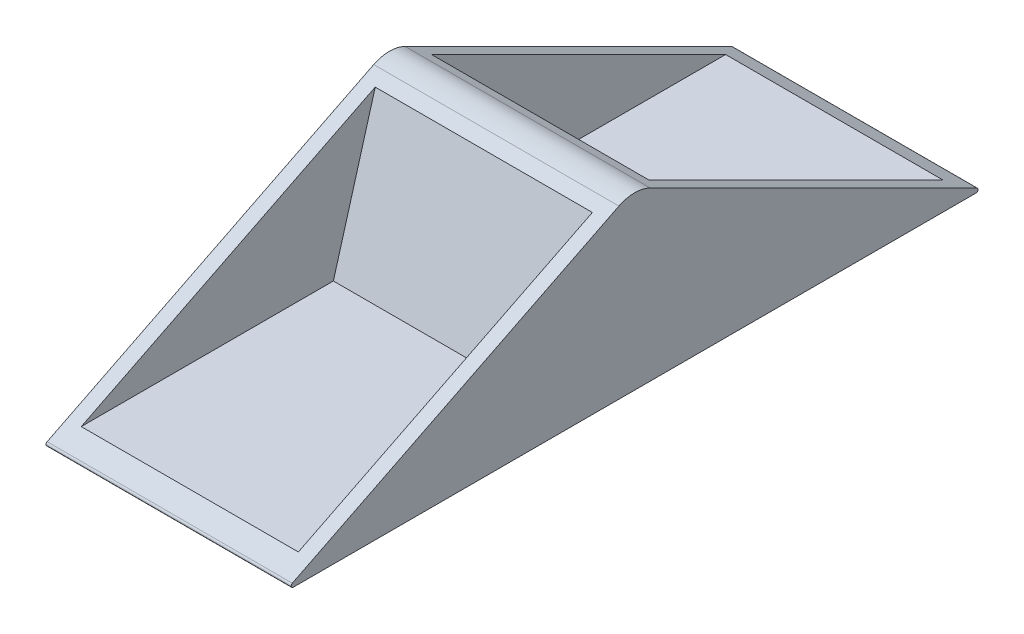
ISO-10303-21;
HEADER;
FILE_DESCRIPTION(('STEP AP214'),'2;1');
FILE_NAME('part.step','',(''),(''),'','','');
FILE_SCHEMA(('AUTOMOTIVE_DESIGN { 1 0 10303 214 1 1 1 1 }'));
ENDSEC;
DATA;
#1=APPLICATION_CONTEXT('core data for automotive mechanical design processes');
#2=APPLICATION_PROTOCOL_DEFINITION('international standard','automotive_design',2000,#1);
#3=PRODUCT_CONTEXT('',#1,'mechanical');
#4=PRODUCT('Part','Part','',(#3));
#5=PRODUCT_RELATED_PRODUCT_CATEGORY('part','',(#4));
#6=PRODUCT_DEFINITION_FORMATION('','',#4);
#7=PRODUCT_DEFINITION_CONTEXT('part definition',#1,'design');
#8=PRODUCT_DEFINITION('design','',#6,#7);
#9=PRODUCT_DEFINITION_SHAPE('','',#8);
#10=(LENGTH_UNIT() NAMED_UNIT(*) SI_UNIT(.MILLI.,.METRE.));
#11=(NAMED_UNIT(*) PLANE_ANGLE_UNIT() SI_UNIT($,.RADIAN.));
#12=(NAMED_UNIT(*) SI_UNIT($,.STERADIAN.) SOLID_ANGLE_UNIT());
#13=UNCERTAINTY_MEASURE_WITH_UNIT(LENGTH_MEASURE(1.E-05),#10,'distance_accuracy_value','');
#14=(GEOMETRIC_REPRESENTATION_CONTEXT(3) GLOBAL_UNCERTAINTY_ASSIGNED_CONTEXT((#13)) GLOBAL_UNIT_ASSIGNED_CONTEXT((#10,
#11,#12)) REPRESENTATION_CONTEXT('',''));
#15=CARTESIAN_POINT('',(0.,0.,0.));
#16=DIRECTION('',(0.,0.,1.));
#17=DIRECTION('',(1.,0.,0.));
#18=AXIS2_PLACEMENT_3D('',#15,#16,#17);
#19=CARTESIAN_POINT('',(35.,0.,0.));
#20=DIRECTION('',(0.,1.,0.));
#21=DIRECTION('',(0.,0.,1.));
#22=AXIS2_PLACEMENT_3D('',#19,#20,#21);
#23=PLANE('',#22);
#24=DIRECTION('',(0.,0.,-1.));
#25=VECTOR('',#24,1.);
#26=CARTESIAN_POINT('',(35.,0.,0.));
#27=LINE('',#26,#25);
#28=CARTESIAN_POINT('',(35.,0.,48.7291796067501));
#29=VERTEX_POINT('',#28);
#30=CARTESIAN_POINT('',(35.,0.,-48.7291796067501));
#31=VERTEX_POINT('',#30);
#32=EDGE_CURVE('E285',#29,#31,#27,.T.);
#33=ORIENTED_EDGE('',*,*,#32,.F.);
#34=DIRECTION('',(-1.,0.,0.));
#35=VECTOR('',#34,1.);
#36=CARTESIAN_POINT('',(0.,0.,48.7291796067501));
#37=LINE('',#36,#35);
#38=CARTESIAN_POINT('',(0.,0.,48.7291796067501));
#39=VERTEX_POINT('',#38);
#40=EDGE_CURVE('E325',#29,#39,#37,.T.);
#41=ORIENTED_EDGE('',*,*,#40,.T.);
#42=DIRECTION('',(0.,0.,-1.));
#43=VECTOR('',#42,1.);
#44=CARTESIAN_POINT('',(0.,0.,0.));
#45=LINE('',#44,#43);
#46=CARTESIAN_POINT('',(0.,0.,-48.7291796067501));
#47=VERTEX_POINT('',#46);
#48=EDGE_CURVE('E283',#39,#47,#45,.T.);
#49=ORIENTED_EDGE('',*,*,#48,.T.);
#50=DIRECTION('',(-1.,0.,0.));
#51=VECTOR('',#50,1.);
#52=CARTESIAN_POINT('',(35.,0.,-48.7291796067501));
#53=LINE('',#52,#51);
#54=EDGE_CURVE('E321',#47,#31,#53,.F.);
#55=ORIENTED_EDGE('',*,*,#54,.T.);
#56=EDGE_LOOP('',(#33,#41,#49,#55));
#57=FACE_BOUND('',#56,.T.);
#58=DIRECTION('',(0.,0.,1.));
#59=VECTOR('',#58,1.);
#60=CARTESIAN_POINT('',(6.5,0.,0.));
#61=LINE('',#60,#59);
#62=CARTESIAN_POINT('',(6.50000000000001,0.,-11.));
#63=VERTEX_POINT('',#62);
#64=CARTESIAN_POINT('',(6.5,0.,11.));
#65=VERTEX_POINT('',#64);
#66=EDGE_CURVE('E56',#63,#65,#61,.T.);
#67=ORIENTED_EDGE('',*,*,#66,.T.);
#68=DIRECTION('',(-1.,0.,0.));
#69=VECTOR('',#68,1.);
#70=CARTESIAN_POINT('',(0.,0.,11.));
#71=LINE('',#70,#69);
#72=CARTESIAN_POINT('',(28.5,0.,11.));
#73=VERTEX_POINT('',#72);
#74=EDGE_CURVE('E173',#73,#65,#71,.T.);
#75=ORIENTED_EDGE('',*,*,#74,.F.);
#76=DIRECTION('',(0.,0.,1.));
#77=VECTOR('',#76,1.);
#78=CARTESIAN_POINT('',(28.5,0.,0.));
#79=LINE('',#78,#77);
#80=CARTESIAN_POINT('',(28.5,0.,-11.));
#81=VERTEX_POINT('',#80);
#82=EDGE_CURVE('E176',#81,#73,#79,.T.);
#83=ORIENTED_EDGE('',*,*,#82,.F.);
#84=DIRECTION('',(-1.,0.,0.));
#85=VECTOR('',#84,1.);
#86=CARTESIAN_POINT('',(0.,0.,-11.));
#87=LINE('',#86,#85);
#88=EDGE_CURVE('E182',#81,#63,#87,.T.);
#89=ORIENTED_EDGE('',*,*,#88,.T.);
#90=EDGE_LOOP('',(#67,#75,#83,#89));
#91=FACE_BOUND('',#90,.T.);
#92=ADVANCED_FACE('F41',(#57,#91),#23,.F.);
#93=CARTESIAN_POINT('',(35.,2.,0.));
#94=DIRECTION('',(0.,1.,0.));
#95=DIRECTION('',(0.,0.,1.));
#96=AXIS2_PLACEMENT_3D('',#93,#94,#95);
#97=PLANE('',#96);
#98=DIRECTION('',(0.,0.,-1.));
#99=VECTOR('',#98,1.);
#100=CARTESIAN_POINT('',(2.,2.,0.));
#101=LINE('',#100,#99);
#102=CARTESIAN_POINT('',(1.99999999999999,2.,-10.));
#103=VERTEX_POINT('',#102);
#104=CARTESIAN_POINT('',(2.,2.,-46.));
#105=VERTEX_POINT('',#104);
#106=EDGE_CURVE('E235',#103,#105,#101,.T.);
#107=ORIENTED_EDGE('',*,*,#106,.F.);
#108=DIRECTION('',(-1.,0.,0.));
#109=VECTOR('',#108,1.);
#110=CARTESIAN_POINT('',(33.,2.,-10.));
#111=LINE('',#110,#109);
#112=CARTESIAN_POINT('',(33.,2.,-10.));
#113=VERTEX_POINT('',#112);
#114=EDGE_CURVE('E210',#113,#103,#111,.T.);
#115=ORIENTED_EDGE('',*,*,#114,.F.);
#116=DIRECTION('',(0.,0.,-1.));
#117=VECTOR('',#116,1.);
#118=CARTESIAN_POINT('',(33.,2.,0.));
#119=LINE('',#118,#117);
#120=CARTESIAN_POINT('',(33.,2.,-46.));
#121=VERTEX_POINT('',#120);
#122=EDGE_CURVE('E249',#113,#121,#119,.T.);
#123=ORIENTED_EDGE('',*,*,#122,.T.);
#124=DIRECTION('',(-1.,0.,0.));
#125=VECTOR('',#124,1.);
#126=CARTESIAN_POINT('',(35.,2.,-46.));
#127=LINE('',#126,#125);
#128=EDGE_CURVE('E253',#121,#105,#127,.T.);
#129=ORIENTED_EDGE('',*,*,#128,.T.);
#130=EDGE_LOOP('',(#107,#115,#123,#129));
#131=FACE_BOUND('',#130,.T.);
#132=ADVANCED_FACE('F342',(#131),#97,.T.);
#133=CARTESIAN_POINT('',(33.,0.,0.));
#134=DIRECTION('',(-1.,0.,0.));
#135=DIRECTION('',(0.,0.,1.));
#136=AXIS2_PLACEMENT_3D('',#133,#134,#135);
#137=PLANE('',#136);
#138=ORIENTED_EDGE('',*,*,#122,.F.);
#139=DIRECTION('',(0.,0.96178211048663,0.273815945386464));
#140=VECTOR('',#139,1.);
#141=CARTESIAN_POINT('',(33.,2.,-10.));
#142=LINE('',#141,#140);
#143=CARTESIAN_POINT('',(33.,22.9875388202502,-4.02492235949965));
#144=VERTEX_POINT('',#143);
#145=EDGE_CURVE('E206',#113,#144,#142,.T.);
#146=ORIENTED_EDGE('',*,*,#145,.T.);
#147=DIRECTION('',(0.,0.447213595499958,0.894427190999916));
#148=VECTOR('',#147,1.);
#149=CARTESIAN_POINT('',(33.,20.,-10.));
#150=LINE('',#149,#148);
#151=EDGE_CURVE('E268',#121,#144,#150,.T.);
#152=ORIENTED_EDGE('',*,*,#151,.F.);
#153=EDGE_LOOP('',(#138,#146,#152));
#154=FACE_BOUND('',#153,.T.);
#155=ADVANCED_FACE('F344',(#154),#137,.T.);
#156=CARTESIAN_POINT('',(2.,0.,0.));
#157=DIRECTION('',(-1.,0.,0.));
#158=DIRECTION('',(0.,0.,1.));
#159=AXIS2_PLACEMENT_3D('',#156,#157,#158);
#160=PLANE('',#159);
#161=DIRECTION('',(0.,0.96178211048663,0.273815945386464));
#162=VECTOR('',#161,1.);
#163=CARTESIAN_POINT('',(1.99999999999999,2.,-10.));
#164=LINE('',#163,#162);
#165=CARTESIAN_POINT('',(1.99999999999999,22.9875388202502,-4.02492235949965));
#166=VERTEX_POINT('',#165);
#167=EDGE_CURVE('E195',#103,#166,#164,.T.);
#168=ORIENTED_EDGE('',*,*,#167,.F.);
#169=ORIENTED_EDGE('',*,*,#106,.T.);
#170=DIRECTION('',(0.,0.447213595499958,0.894427190999916));
#171=VECTOR('',#170,1.);
#172=CARTESIAN_POINT('',(2.,20.,-10.));
#173=LINE('',#172,#171);
#174=EDGE_CURVE('E243',#105,#166,#173,.T.);
#175=ORIENTED_EDGE('',*,*,#174,.T.);
#176=EDGE_LOOP('',(#168,#169,#175));
#177=FACE_BOUND('',#176,.T.);
#178=ADVANCED_FACE('F347',(#177),#160,.F.);
#179=DIRECTION('',(-1.,0.,0.));
#180=VECTOR('',#179,1.);
#181=CARTESIAN_POINT('',(33.,2.,10.));
#182=LINE('',#181,#180);
#183=CARTESIAN_POINT('',(33.,2.,10.));
#184=VERTEX_POINT('',#183);
#185=CARTESIAN_POINT('',(2.,2.,10.));
#186=VERTEX_POINT('',#185);
#187=EDGE_CURVE('E196',#184,#186,#182,.T.);
#188=ORIENTED_EDGE('',*,*,#187,.T.);
#189=CARTESIAN_POINT('',(2.,2.,46.));
#190=VERTEX_POINT('',#189);
#191=EDGE_CURVE('E239',#190,#186,#101,.T.);
#192=ORIENTED_EDGE('',*,*,#191,.F.);
#193=DIRECTION('',(-1.,0.,0.));
#194=VECTOR('',#193,1.);
#195=CARTESIAN_POINT('',(35.,2.,46.));
#196=LINE('',#195,#194);
#197=CARTESIAN_POINT('',(33.,2.,46.));
#198=VERTEX_POINT('',#197);
#199=EDGE_CURVE('E256',#198,#190,#196,.T.);
#200=ORIENTED_EDGE('',*,*,#199,.F.);
#201=EDGE_CURVE('E266',#198,#184,#119,.T.);
#202=ORIENTED_EDGE('',*,*,#201,.T.);
#203=EDGE_LOOP('',(#188,#192,#200,#202));
#204=FACE_BOUND('',#203,.T.);
#205=ADVANCED_FACE('F366',(#204),#97,.T.);
#206=DIRECTION('',(0.,0.96178211048663,-0.273815945386464));
#207=VECTOR('',#206,1.);
#208=CARTESIAN_POINT('',(33.,2.,10.));
#209=LINE('',#208,#207);
#210=CARTESIAN_POINT('',(33.,22.9875388202502,4.02492235949964));
#211=VERTEX_POINT('',#210);
#212=EDGE_CURVE('E192',#184,#211,#209,.T.);
#213=ORIENTED_EDGE('',*,*,#212,.F.);
#214=ORIENTED_EDGE('',*,*,#201,.F.);
#215=DIRECTION('',(0.,0.447213595499958,-0.894427190999916));
#216=VECTOR('',#215,1.);
#217=CARTESIAN_POINT('',(33.,20.,10.));
#218=LINE('',#217,#216);
#219=EDGE_CURVE('E259',#198,#211,#218,.T.);
#220=ORIENTED_EDGE('',*,*,#219,.T.);
#221=EDGE_LOOP('',(#213,#214,#220));
#222=FACE_BOUND('',#221,.T.);
#223=ADVANCED_FACE('F486',(#222),#137,.T.);
#224=ORIENTED_EDGE('',*,*,#191,.T.);
#225=DIRECTION('',(0.,0.96178211048663,-0.273815945386464));
#226=VECTOR('',#225,1.);
#227=CARTESIAN_POINT('',(1.99999999999999,2.,10.));
#228=LINE('',#227,#226);
#229=CARTESIAN_POINT('',(1.99999999999999,22.9875388202502,4.02492235949964));
#230=VERTEX_POINT('',#229);
#231=EDGE_CURVE('E188',#186,#230,#228,.T.);
#232=ORIENTED_EDGE('',*,*,#231,.T.);
#233=DIRECTION('',(0.,0.447213595499958,-0.894427190999916));
#234=VECTOR('',#233,1.);
#235=CARTESIAN_POINT('',(2.,20.,10.));
#236=LINE('',#235,#234);
#237=EDGE_CURVE('E222',#190,#230,#236,.T.);
#238=ORIENTED_EDGE('',*,*,#237,.F.);
#239=EDGE_LOOP('',(#224,#232,#238));
#240=FACE_BOUND('',#239,.T.);
#241=ADVANCED_FACE('F460',(#240),#160,.F.);
#242=CARTESIAN_POINT('',(35.,25.,0.));
#243=DIRECTION('',(0.,-0.894427190999916,0.447213595499958));
#244=DIRECTION('',(0.,-0.447213595499958,-0.894427190999916));
#245=AXIS2_PLACEMENT_3D('',#242,#243,#244);
#246=PLANE('',#245);
#247=DIRECTION('',(0.,0.447213595499958,0.894427190999916));
#248=VECTOR('',#247,1.);
#249=CARTESIAN_POINT('',(35.,25.,0.));
#250=LINE('',#249,#248);
#251=CARTESIAN_POINT('',(35.,0.568328157299965,-48.8633436854001));
#252=VERTEX_POINT('',#251);
#253=CARTESIAN_POINT('',(35.,23.8819660112501,-2.23606797749979));
#254=VERTEX_POINT('',#253);
#255=EDGE_CURVE('E287',#252,#254,#250,.T.);
#256=ORIENTED_EDGE('',*,*,#255,.F.);
#257=DIRECTION('',(-1.,0.,0.));
#258=VECTOR('',#257,1.);
#259=CARTESIAN_POINT('',(35.,0.568328157299972,-48.8633436854001));
#260=LINE('',#259,#258);
#261=CARTESIAN_POINT('',(0.,0.568328157299965,-48.8633436854001));
#262=VERTEX_POINT('',#261);
#263=EDGE_CURVE('E304',#252,#262,#260,.T.);
#264=ORIENTED_EDGE('',*,*,#263,.T.);
#265=DIRECTION('',(0.,0.447213595499958,0.894427190999916));
#266=VECTOR('',#265,1.);
#267=CARTESIAN_POINT('',(0.,25.,0.));
#268=LINE('',#267,#266);
#269=CARTESIAN_POINT('',(0.,23.8819660112501,-2.23606797749979));
#270=VERTEX_POINT('',#269);
#271=EDGE_CURVE('E244',#262,#270,#268,.T.);
#272=ORIENTED_EDGE('',*,*,#271,.T.);
#273=DIRECTION('',(-1.,0.,0.));
#274=VECTOR('',#273,1.);
#275=CARTESIAN_POINT('',(35.,23.8819660112501,-2.23606797749979));
#276=LINE('',#275,#274);
#277=EDGE_CURVE('E301',#270,#254,#276,.F.);
#278=ORIENTED_EDGE('',*,*,#277,.T.);
#279=EDGE_LOOP('',(#256,#264,#272,#278));
#280=FACE_BOUND('',#279,.T.);
#281=ORIENTED_EDGE('',*,*,#174,.F.);
#282=ORIENTED_EDGE('',*,*,#128,.F.);
#283=ORIENTED_EDGE('',*,*,#151,.T.);
#284=DIRECTION('',(-1.,0.,0.));
#285=VECTOR('',#284,1.);
#286=CARTESIAN_POINT('',(33.,22.9875388202502,-4.02492235949965));
#287=LINE('',#286,#285);
#288=EDGE_CURVE('E209',#144,#166,#287,.T.);
#289=ORIENTED_EDGE('',*,*,#288,.T.);
#290=EDGE_LOOP('',(#281,#282,#283,#289));
#291=FACE_BOUND('',#290,.T.);
#292=ADVANCED_FACE('F299',(#280,#291),#246,.F.);
#293=CARTESIAN_POINT('',(35.,25.,0.));
#294=DIRECTION('',(0.,0.894427190999916,0.447213595499958));
#295=DIRECTION('',(0.,-0.447213595499958,0.894427190999916));
#296=AXIS2_PLACEMENT_3D('',#293,#294,#295);
#297=PLANE('',#296);
#298=DIRECTION('',(-1.,0.,0.));
#299=VECTOR('',#298,1.);
#300=CARTESIAN_POINT('',(33.,22.9875388202502,4.02492235949964));
#301=LINE('',#300,#299);
#302=EDGE_CURVE('E219',#211,#230,#301,.T.);
#303=ORIENTED_EDGE('',*,*,#302,.F.);
#304=ORIENTED_EDGE('',*,*,#219,.F.);
#305=ORIENTED_EDGE('',*,*,#199,.T.);
#306=ORIENTED_EDGE('',*,*,#237,.T.);
#307=EDGE_LOOP('',(#303,#304,#305,#306));
#308=FACE_BOUND('',#307,.T.);
#309=DIRECTION('',(0.,0.447213595499958,-0.894427190999916));
#310=VECTOR('',#309,1.);
#311=CARTESIAN_POINT('',(0.,25.,0.));
#312=LINE('',#311,#310);
#313=CARTESIAN_POINT('',(0.,0.568328157299965,48.8633436854001));
#314=VERTEX_POINT('',#313);
#315=CARTESIAN_POINT('',(0.,23.8819660112501,2.23606797749979));
#316=VERTEX_POINT('',#315);
#317=EDGE_CURVE('E274',#314,#316,#312,.T.);
#318=ORIENTED_EDGE('',*,*,#317,.F.);
#319=DIRECTION('',(-1.,0.,0.));
#320=VECTOR('',#319,1.);
#321=CARTESIAN_POINT('',(35.,0.568328157299973,48.8633436854001));
#322=LINE('',#321,#320);
#323=CARTESIAN_POINT('',(35.,0.568328157299965,48.8633436854001));
#324=VERTEX_POINT('',#323);
#325=EDGE_CURVE('E49',#314,#324,#322,.F.);
#326=ORIENTED_EDGE('',*,*,#325,.T.);
#327=DIRECTION('',(0.,0.447213595499958,-0.894427190999916));
#328=VECTOR('',#327,1.);
#329=CARTESIAN_POINT('',(35.,25.,0.));
#330=LINE('',#329,#328);
#331=CARTESIAN_POINT('',(35.,23.8819660112501,2.23606797749979));
#332=VERTEX_POINT('',#331);
#333=EDGE_CURVE('E278',#324,#332,#330,.T.);
#334=ORIENTED_EDGE('',*,*,#333,.T.);
#335=DIRECTION('',(-1.,0.,0.));
#336=VECTOR('',#335,1.);
#337=CARTESIAN_POINT('',(0.,23.8819660112501,2.23606797749979));
#338=LINE('',#337,#336);
#339=EDGE_CURVE('E288',#332,#316,#338,.T.);
#340=ORIENTED_EDGE('',*,*,#339,.T.);
#341=EDGE_LOOP('',(#318,#326,#334,#340));
#342=FACE_BOUND('',#341,.T.);
#343=ADVANCED_FACE('F330',(#308,#342),#297,.T.);
#344=CARTESIAN_POINT('',(35.,0.,0.));
#345=DIRECTION('',(-1.,0.,0.));
#346=DIRECTION('',(0.,0.,1.));
#347=AXIS2_PLACEMENT_3D('',#344,#345,#346);
#348=PLANE('',#347);
#349=ORIENTED_EDGE('',*,*,#333,.F.);
#350=CARTESIAN_POINT('',(35.,0.3,48.7291796067501));
#351=DIRECTION('',(-1.,0.,0.));
#352=DIRECTION('',(0.,0.,1.));
#353=AXIS2_PLACEMENT_3D('',#350,#351,#352);
#354=CIRCLE('',#353,0.3);
#355=EDGE_CURVE('E12',#324,#29,#354,.F.);
#356=ORIENTED_EDGE('',*,*,#355,.T.);
#357=ORIENTED_EDGE('',*,*,#32,.T.);
#358=CARTESIAN_POINT('',(35.,0.300000000000002,-48.7291796067501));
#359=DIRECTION('',(-1.,0.,0.));
#360=DIRECTION('',(0.,0.,1.));
#361=AXIS2_PLACEMENT_3D('',#358,#359,#360);
#362=CIRCLE('',#361,0.3);
#363=EDGE_CURVE('E323',#31,#252,#362,.F.);
#364=ORIENTED_EDGE('',*,*,#363,.T.);
#365=ORIENTED_EDGE('',*,*,#255,.T.);
#366=CARTESIAN_POINT('',(35.,19.4098300562505,0.));
#367=DIRECTION('',(-1.,0.,0.));
#368=DIRECTION('',(0.,0.,1.));
#369=AXIS2_PLACEMENT_3D('',#366,#367,#368);
#370=CIRCLE('',#369,5.);
#371=EDGE_CURVE('E313',#254,#332,#370,.F.);
#372=ORIENTED_EDGE('',*,*,#371,.T.);
#373=EDGE_LOOP('',(#349,#356,#357,#364,#365,#372));
#374=FACE_BOUND('',#373,.T.);
#375=ADVANCED_FACE('F334',(#374),#348,.F.);
#376=CARTESIAN_POINT('',(0.,0.,0.));
#377=DIRECTION('',(-1.,0.,0.));
#378=DIRECTION('',(0.,0.,1.));
#379=AXIS2_PLACEMENT_3D('',#376,#377,#378);
#380=PLANE('',#379);
#381=ORIENTED_EDGE('',*,*,#48,.F.);
#382=CARTESIAN_POINT('',(0.,0.3,48.7291796067501));
#383=DIRECTION('',(-1.,0.,0.));
#384=DIRECTION('',(0.,0.,1.));
#385=AXIS2_PLACEMENT_3D('',#382,#383,#384);
#386=CIRCLE('',#385,0.3);
#387=EDGE_CURVE('E327',#39,#314,#386,.T.);
#388=ORIENTED_EDGE('',*,*,#387,.T.);
#389=ORIENTED_EDGE('',*,*,#317,.T.);
#390=CARTESIAN_POINT('',(0.,19.4098300562505,0.));
#391=DIRECTION('',(-1.,0.,0.));
#392=DIRECTION('',(0.,0.,1.));
#393=AXIS2_PLACEMENT_3D('',#390,#391,#392);
#394=CIRCLE('',#393,5.);
#395=EDGE_CURVE('E305',#316,#270,#394,.T.);
#396=ORIENTED_EDGE('',*,*,#395,.T.);
#397=ORIENTED_EDGE('',*,*,#271,.F.);
#398=CARTESIAN_POINT('',(0.,0.300000000000002,-48.7291796067501));
#399=DIRECTION('',(-1.,0.,0.));
#400=DIRECTION('',(0.,0.,1.));
#401=AXIS2_PLACEMENT_3D('',#398,#399,#400);
#402=CIRCLE('',#401,0.3);
#403=EDGE_CURVE('E319',#262,#47,#402,.T.);
#404=ORIENTED_EDGE('',*,*,#403,.T.);
#405=EDGE_LOOP('',(#381,#388,#389,#396,#397,#404));
#406=FACE_BOUND('',#405,.T.);
#407=ADVANCED_FACE('F306',(#406),#380,.T.);
#408=CARTESIAN_POINT('',(33.,2.,-10.));
#409=DIRECTION('',(0.,-0.273815945386464,0.961782110486631));
#410=DIRECTION('',(0.,-0.961782110486631,-0.273815945386464));
#411=AXIS2_PLACEMENT_3D('',#408,#409,#410);
#412=PLANE('',#411);
#413=ORIENTED_EDGE('',*,*,#167,.T.);
#414=ORIENTED_EDGE('',*,*,#288,.F.);
#415=ORIENTED_EDGE('',*,*,#145,.F.);
#416=ORIENTED_EDGE('',*,*,#114,.T.);
#417=EDGE_LOOP('',(#413,#414,#415,#416));
#418=FACE_BOUND('',#417,.T.);
#419=ADVANCED_FACE('F349',(#418),#412,.F.);
#420=CARTESIAN_POINT('',(33.,2.,10.));
#421=DIRECTION('',(0.,0.273815945386464,0.96178211048663));
#422=DIRECTION('',(0.,-0.961782110486631,0.273815945386464));
#423=AXIS2_PLACEMENT_3D('',#420,#421,#422);
#424=PLANE('',#423);
#425=ORIENTED_EDGE('',*,*,#231,.F.);
#426=ORIENTED_EDGE('',*,*,#187,.F.);
#427=ORIENTED_EDGE('',*,*,#212,.T.);
#428=ORIENTED_EDGE('',*,*,#302,.T.);
#429=EDGE_LOOP('',(#425,#426,#427,#428));
#430=FACE_BOUND('',#429,.T.);
#431=ADVANCED_FACE('F351',(#430),#424,.T.);
#432=CARTESIAN_POINT('',(35.,19.4098300562505,0.));
#433=DIRECTION('',(1.,0.,0.));
#434=DIRECTION('',(0.,0.,-1.));
#435=AXIS2_PLACEMENT_3D('',#432,#433,#434);
#436=CYLINDRICAL_SURFACE('',#435,5.);
#437=ORIENTED_EDGE('',*,*,#371,.F.);
#438=ORIENTED_EDGE('',*,*,#277,.F.);
#439=ORIENTED_EDGE('',*,*,#395,.F.);
#440=ORIENTED_EDGE('',*,*,#339,.F.);
#441=EDGE_LOOP('',(#437,#438,#439,#440));
#442=FACE_BOUND('',#441,.T.);
#443=ADVANCED_FACE('F311',(#442),#436,.T.);
#444=CARTESIAN_POINT('',(35.,0.300000000000002,-48.7291796067501));
#445=DIRECTION('',(-1.,0.,0.));
#446=DIRECTION('',(0.,0.,1.));
#447=AXIS2_PLACEMENT_3D('',#444,#445,#446);
#448=CYLINDRICAL_SURFACE('',#447,0.3);
#449=ORIENTED_EDGE('',*,*,#363,.F.);
#450=ORIENTED_EDGE('',*,*,#54,.F.);
#451=ORIENTED_EDGE('',*,*,#403,.F.);
#452=ORIENTED_EDGE('',*,*,#263,.F.);
#453=EDGE_LOOP('',(#449,#450,#451,#452));
#454=FACE_BOUND('',#453,.T.);
#455=ADVANCED_FACE('F339',(#454),#448,.T.);
#456=CARTESIAN_POINT('',(35.,0.3,48.7291796067501));
#457=DIRECTION('',(1.,0.,0.));
#458=DIRECTION('',(0.,0.,-1.));
#459=AXIS2_PLACEMENT_3D('',#456,#457,#458);
#460=CYLINDRICAL_SURFACE('',#459,0.3);
#461=ORIENTED_EDGE('',*,*,#355,.F.);
#462=ORIENTED_EDGE('',*,*,#325,.F.);
#463=ORIENTED_EDGE('',*,*,#387,.F.);
#464=ORIENTED_EDGE('',*,*,#40,.F.);
#465=EDGE_LOOP('',(#461,#462,#463,#464));
#466=FACE_BOUND('',#465,.T.);
#467=ADVANCED_FACE('F43',(#466),#460,.T.);
#468=CARTESIAN_POINT('',(6.5,1.,0.));
#469=DIRECTION('',(1.,0.,0.));
#470=DIRECTION('',(0.,0.,-1.));
#471=AXIS2_PLACEMENT_3D('',#468,#469,#470);
#472=PLANE('',#471);
#473=ORIENTED_EDGE('',*,*,#66,.F.);
#474=DIRECTION('',(0.,-1.,0.));
#475=VECTOR('',#474,1.);
#476=CARTESIAN_POINT('',(6.5,1.,-11.));
#477=LINE('',#476,#475);
#478=CARTESIAN_POINT('',(6.5,1.,-11.));
#479=VERTEX_POINT('',#478);
#480=EDGE_CURVE('E156',#479,#63,#477,.T.);
#481=ORIENTED_EDGE('',*,*,#480,.F.);
#482=DIRECTION('',(0.,0.,1.));
#483=VECTOR('',#482,1.);
#484=CARTESIAN_POINT('',(6.5,1.,0.));
#485=LINE('',#484,#483);
#486=CARTESIAN_POINT('',(6.5,1.,11.));
#487=VERTEX_POINT('',#486);
#488=EDGE_CURVE('E164',#479,#487,#485,.T.);
#489=ORIENTED_EDGE('',*,*,#488,.T.);
#490=DIRECTION('',(0.,-1.,0.));
#491=VECTOR('',#490,1.);
#492=CARTESIAN_POINT('',(6.5,1.,11.));
#493=LINE('',#492,#491);
#494=EDGE_CURVE('E186',#487,#65,#493,.T.);
#495=ORIENTED_EDGE('',*,*,#494,.T.);
#496=EDGE_LOOP('',(#473,#481,#489,#495));
#497=FACE_BOUND('',#496,.T.);
#498=ADVANCED_FACE('F166',(#497),#472,.T.);
#499=CARTESIAN_POINT('',(0.,1.,11.));
#500=DIRECTION('',(0.,0.,1.));
#501=DIRECTION('',(1.,0.,0.));
#502=AXIS2_PLACEMENT_3D('',#499,#500,#501);
#503=PLANE('',#502);
#504=ORIENTED_EDGE('',*,*,#74,.T.);
#505=ORIENTED_EDGE('',*,*,#494,.F.);
#506=DIRECTION('',(-1.,0.,0.));
#507=VECTOR('',#506,1.);
#508=CARTESIAN_POINT('',(0.,1.,11.));
#509=LINE('',#508,#507);
#510=CARTESIAN_POINT('',(28.5,1.,11.));
#511=VERTEX_POINT('',#510);
#512=EDGE_CURVE('E168',#511,#487,#509,.T.);
#513=ORIENTED_EDGE('',*,*,#512,.F.);
#514=DIRECTION('',(0.,-1.,0.));
#515=VECTOR('',#514,1.);
#516=CARTESIAN_POINT('',(28.5,1.,11.));
#517=LINE('',#516,#515);
#518=EDGE_CURVE('E189',#511,#73,#517,.T.);
#519=ORIENTED_EDGE('',*,*,#518,.T.);
#520=EDGE_LOOP('',(#504,#505,#513,#519));
#521=FACE_BOUND('',#520,.T.);
#522=ADVANCED_FACE('F377',(#521),#503,.F.);
#523=CARTESIAN_POINT('',(28.5,1.,0.));
#524=DIRECTION('',(1.,0.,0.));
#525=DIRECTION('',(0.,0.,-1.));
#526=AXIS2_PLACEMENT_3D('',#523,#524,#525);
#527=PLANE('',#526);
#528=ORIENTED_EDGE('',*,*,#82,.T.);
#529=ORIENTED_EDGE('',*,*,#518,.F.);
#530=DIRECTION('',(0.,0.,1.));
#531=VECTOR('',#530,1.);
#532=CARTESIAN_POINT('',(28.5,1.,0.));
#533=LINE('',#532,#531);
#534=CARTESIAN_POINT('',(28.5,1.,-11.));
#535=VERTEX_POINT('',#534);
#536=EDGE_CURVE('E163',#535,#511,#533,.T.);
#537=ORIENTED_EDGE('',*,*,#536,.F.);
#538=DIRECTION('',(0.,-1.,0.));
#539=VECTOR('',#538,1.);
#540=CARTESIAN_POINT('',(28.5,1.,-11.));
#541=LINE('',#540,#539);
#542=EDGE_CURVE('E158',#535,#81,#541,.T.);
#543=ORIENTED_EDGE('',*,*,#542,.T.);
#544=EDGE_LOOP('',(#528,#529,#537,#543));
#545=FACE_BOUND('',#544,.T.);
#546=ADVANCED_FACE('F382',(#545),#527,.F.);
#547=CARTESIAN_POINT('',(0.,1.,-11.));
#548=DIRECTION('',(0.,0.,1.));
#549=DIRECTION('',(1.,0.,0.));
#550=AXIS2_PLACEMENT_3D('',#547,#548,#549);
#551=PLANE('',#550);
#552=ORIENTED_EDGE('',*,*,#88,.F.);
#553=ORIENTED_EDGE('',*,*,#542,.F.);
#554=DIRECTION('',(-1.,0.,0.));
#555=VECTOR('',#554,1.);
#556=CARTESIAN_POINT('',(0.,1.,-11.));
#557=LINE('',#556,#555);
#558=EDGE_CURVE('E153',#535,#479,#557,.T.);
#559=ORIENTED_EDGE('',*,*,#558,.T.);
#560=ORIENTED_EDGE('',*,*,#480,.T.);
#561=EDGE_LOOP('',(#552,#553,#559,#560));
#562=FACE_BOUND('',#561,.T.);
#563=ADVANCED_FACE('F155',(#562),#551,.T.);
#564=CARTESIAN_POINT('',(0.,1.,0.));
#565=DIRECTION('',(0.,-1.,0.));
#566=DIRECTION('',(0.,0.,-1.));
#567=AXIS2_PLACEMENT_3D('',#564,#565,#566);
#568=PLANE('',#567);
#569=ORIENTED_EDGE('',*,*,#488,.F.);
#570=ORIENTED_EDGE('',*,*,#558,.F.);
#571=ORIENTED_EDGE('',*,*,#536,.T.);
#572=ORIENTED_EDGE('',*,*,#512,.T.);
#573=EDGE_LOOP('',(#569,#570,#571,#572));
#574=FACE_BOUND('',#573,.T.);
#575=ADVANCED_FACE('F171',(#574),#568,.T.);
#576=CLOSED_SHELL('',(#92,#132,#155,#178,#205,#223,#241,#292,#343,#375,#407,#419,#431,#443,#455,
#467,#498,#522,#546,#563,#575));
#577=MANIFOLD_SOLID_BREP('B2',#576);
#578=ADVANCED_BREP_SHAPE_REPRESENTATION('',(#18,#577),#14);
#579=SHAPE_DEFINITION_REPRESENTATION(#9,#578);
ENDSEC;
END-ISO-10303-21;
